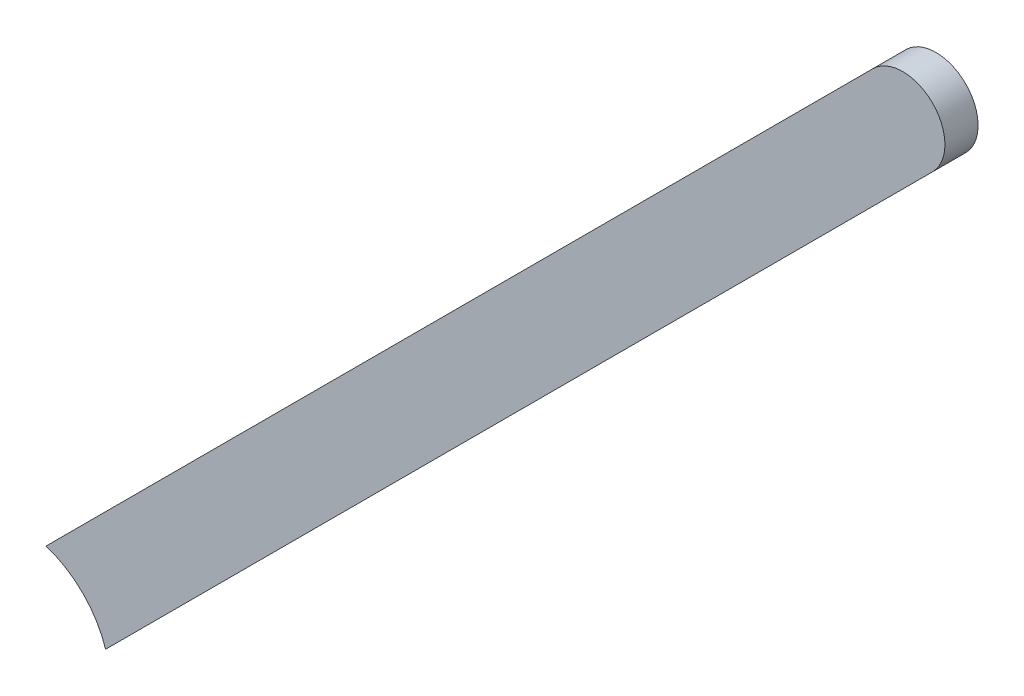
ISO-10303-21;
HEADER;
FILE_DESCRIPTION(('STEP AP214'),'2;1');
FILE_NAME('part.step','',(''),(''),'','','');
FILE_SCHEMA(('AUTOMOTIVE_DESIGN { 1 0 10303 214 1 1 1 1 }'));
ENDSEC;
DATA;
#1=APPLICATION_CONTEXT('core data for automotive mechanical design processes');
#2=APPLICATION_PROTOCOL_DEFINITION('international standard','automotive_design',2000,#1);
#3=PRODUCT_CONTEXT('',#1,'mechanical');
#4=PRODUCT('Part','Part','',(#3));
#5=PRODUCT_RELATED_PRODUCT_CATEGORY('part','',(#4));
#6=PRODUCT_DEFINITION_FORMATION('','',#4);
#7=PRODUCT_DEFINITION_CONTEXT('part definition',#1,'design');
#8=PRODUCT_DEFINITION('design','',#6,#7);
#9=PRODUCT_DEFINITION_SHAPE('','',#8);
#10=(LENGTH_UNIT() NAMED_UNIT(*) SI_UNIT(.MILLI.,.METRE.));
#11=(NAMED_UNIT(*) PLANE_ANGLE_UNIT() SI_UNIT($,.RADIAN.));
#12=(NAMED_UNIT(*) SI_UNIT($,.STERADIAN.) SOLID_ANGLE_UNIT());
#13=UNCERTAINTY_MEASURE_WITH_UNIT(LENGTH_MEASURE(1.E-05),#10,'distance_accuracy_value','');
#14=(GEOMETRIC_REPRESENTATION_CONTEXT(3) GLOBAL_UNCERTAINTY_ASSIGNED_CONTEXT((#13)) GLOBAL_UNIT_ASSIGNED_CONTEXT((#10,
#11,#12)) REPRESENTATION_CONTEXT('',''));
#15=CARTESIAN_POINT('',(0.,0.,0.));
#16=DIRECTION('',(0.,0.,1.));
#17=DIRECTION('',(1.,0.,0.));
#18=AXIS2_PLACEMENT_3D('',#15,#16,#17);
#19=CARTESIAN_POINT('',(94.3815390211441,98.7183299411441,0.));
#20=DIRECTION('',(-0.707106781186548,0.707106781186548,0.));
#21=DIRECTION('',(0.707106781186548,0.707106781186548,0.));
#22=AXIS2_PLACEMENT_3D('',#19,#20,#21);
#23=PLANE('',#22);
#24=DIRECTION('',(0.707106781186548,0.707106781186548,0.));
#25=VECTOR('',#24,1.);
#26=CARTESIAN_POINT('',(94.03260594,98.36939686,0.1999996));
#27=LINE('',#26,#25);
#28=CARTESIAN_POINT('',(94.3815390211441,98.7183299411441,0.1999996));
#29=VERTEX_POINT('',#28);
#30=CARTESIAN_POINT('',(99.36660594,103.70339686,0.1999996));
#31=VERTEX_POINT('',#30);
#32=EDGE_CURVE('E11',#29,#31,#27,.T.);
#33=ORIENTED_EDGE('',*,*,#32,.F.);
#34=DIRECTION('',(0.,0.,1.));
#35=VECTOR('',#34,1.);
#36=CARTESIAN_POINT('',(94.3815390211441,98.7183299411441,0.));
#37=LINE('',#36,#35);
#38=CARTESIAN_POINT('',(94.3815390211441,98.7183299411441,0.));
#39=VERTEX_POINT('',#38);
#40=EDGE_CURVE('E24',#39,#29,#37,.T.);
#41=ORIENTED_EDGE('',*,*,#40,.F.);
#42=DIRECTION('',(0.707106781186548,0.707106781186548,0.));
#43=VECTOR('',#42,1.);
#44=CARTESIAN_POINT('',(94.03260594,98.36939686,0.));
#45=LINE('',#44,#43);
#46=CARTESIAN_POINT('',(99.36660594,103.70339686,0.));
#47=VERTEX_POINT('',#46);
#48=EDGE_CURVE('E75',#39,#47,#45,.T.);
#49=ORIENTED_EDGE('',*,*,#48,.T.);
#50=DIRECTION('',(0.,0.,1.));
#51=VECTOR('',#50,1.);
#52=CARTESIAN_POINT('',(99.36660594,103.70339686,0.));
#53=LINE('',#52,#51);
#54=EDGE_CURVE('E37',#47,#31,#53,.T.);
#55=ORIENTED_EDGE('',*,*,#54,.T.);
#56=EDGE_LOOP('',(#33,#41,#49,#55));
#57=FACE_BOUND('',#56,.T.);
#58=ADVANCED_FACE('F17',(#57),#23,.F.);
#59=CARTESIAN_POINT('',(99.187,103.8830028,0.));
#60=DIRECTION('',(0.,0.,-1.));
#61=DIRECTION('',(0.707106781186548,-0.707106781186548,0.));
#62=AXIS2_PLACEMENT_3D('',#59,#60,#61);
#63=CYLINDRICAL_SURFACE('',#62,0.254001156230774);
#64=CARTESIAN_POINT('',(99.187,103.8830028,0.1999996));
#65=DIRECTION('',(0.,0.,1.));
#66=DIRECTION('',(0.707106781186548,-0.707106781186548,0.));
#67=AXIS2_PLACEMENT_3D('',#64,#65,#66);
#68=CIRCLE('',#67,0.254001156230774);
#69=CARTESIAN_POINT('',(99.00739406,104.06260874,0.1999996));
#70=VERTEX_POINT('',#69);
#71=EDGE_CURVE('E83',#31,#70,#68,.T.);
#72=ORIENTED_EDGE('',*,*,#71,.F.);
#73=ORIENTED_EDGE('',*,*,#54,.F.);
#74=CARTESIAN_POINT('',(99.187,103.8830028,0.));
#75=DIRECTION('',(0.,0.,1.));
#76=DIRECTION('',(0.707106781186548,-0.707106781186548,0.));
#77=AXIS2_PLACEMENT_3D('',#74,#75,#76);
#78=CIRCLE('',#77,0.254001156230774);
#79=CARTESIAN_POINT('',(99.00739406,104.06260874,0.));
#80=VERTEX_POINT('',#79);
#81=EDGE_CURVE('E81',#47,#80,#78,.T.);
#82=ORIENTED_EDGE('',*,*,#81,.T.);
#83=DIRECTION('',(0.,0.,1.));
#84=VECTOR('',#83,1.);
#85=CARTESIAN_POINT('',(99.00739406,104.06260874,0.));
#86=LINE('',#85,#84);
#87=EDGE_CURVE('E67',#80,#70,#86,.T.);
#88=ORIENTED_EDGE('',*,*,#87,.T.);
#89=EDGE_LOOP('',(#72,#73,#82,#88));
#90=FACE_BOUND('',#89,.T.);
#91=ADVANCED_FACE('F89',(#90),#63,.T.);
#92=CARTESIAN_POINT('',(99.00739406,104.06260874,0.));
#93=DIRECTION('',(0.707106781186548,-0.707106781186548,0.));
#94=DIRECTION('',(-0.707106781186548,-0.707106781186548,0.));
#95=AXIS2_PLACEMENT_3D('',#92,#93,#94);
#96=PLANE('',#95);
#97=DIRECTION('',(-0.707106781186548,-0.707106781186548,0.));
#98=VECTOR('',#97,1.);
#99=CARTESIAN_POINT('',(99.00739406,104.06260874,0.1999996));
#100=LINE('',#99,#98);
#101=CARTESIAN_POINT('',(94.0223271411441,99.0775418211441,0.1999996));
#102=VERTEX_POINT('',#101);
#103=EDGE_CURVE('E71',#70,#102,#100,.T.);
#104=ORIENTED_EDGE('',*,*,#103,.F.);
#105=ORIENTED_EDGE('',*,*,#87,.F.);
#106=DIRECTION('',(-0.707106781186548,-0.707106781186548,0.));
#107=VECTOR('',#106,1.);
#108=CARTESIAN_POINT('',(99.00739406,104.06260874,0.));
#109=LINE('',#108,#107);
#110=CARTESIAN_POINT('',(94.0223271411441,99.0775418211441,0.));
#111=VERTEX_POINT('',#110);
#112=EDGE_CURVE('E63',#80,#111,#109,.T.);
#113=ORIENTED_EDGE('',*,*,#112,.T.);
#114=DIRECTION('',(0.,0.,1.));
#115=VECTOR('',#114,1.);
#116=CARTESIAN_POINT('',(94.0223271411441,99.0775418211441,0.));
#117=LINE('',#116,#115);
#118=EDGE_CURVE('E53',#111,#102,#117,.T.);
#119=ORIENTED_EDGE('',*,*,#118,.T.);
#120=EDGE_LOOP('',(#104,#105,#113,#119));
#121=FACE_BOUND('',#120,.T.);
#122=ADVANCED_FACE('F66',(#121),#96,.F.);
#123=CARTESIAN_POINT('',(93.853,98.5490028,0.));
#124=DIRECTION('',(0.,0.,-1.));
#125=DIRECTION('',(1.,0.,0.));
#126=AXIS2_PLACEMENT_3D('',#123,#124,#125);
#127=CYLINDRICAL_SURFACE('',#126,0.55500016);
#128=ORIENTED_EDGE('',*,*,#40,.T.);
#129=CARTESIAN_POINT('',(93.853,98.5490028,0.1999996));
#130=DIRECTION('',(0.,0.,1.));
#131=DIRECTION('',(1.,0.,0.));
#132=AXIS2_PLACEMENT_3D('',#129,#130,#131);
#133=CIRCLE('',#132,0.55500016);
#134=EDGE_CURVE('E59',#29,#102,#133,.T.);
#135=ORIENTED_EDGE('',*,*,#134,.T.);
#136=ORIENTED_EDGE('',*,*,#118,.F.);
#137=CARTESIAN_POINT('',(93.853,98.5490028,0.));
#138=DIRECTION('',(0.,0.,1.));
#139=DIRECTION('',(1.,0.,0.));
#140=AXIS2_PLACEMENT_3D('',#137,#138,#139);
#141=CIRCLE('',#140,0.55500016);
#142=EDGE_CURVE('E57',#39,#111,#141,.T.);
#143=ORIENTED_EDGE('',*,*,#142,.F.);
#144=EDGE_LOOP('',(#128,#135,#136,#143));
#145=FACE_BOUND('',#144,.T.);
#146=ADVANCED_FACE('F55',(#145),#127,.F.);
#147=CARTESIAN_POINT('',(94.03260594,98.36939686,0.));
#148=DIRECTION('',(0.,0.,-1.));
#149=DIRECTION('',(-1.,0.,0.));
#150=AXIS2_PLACEMENT_3D('',#147,#148,#149);
#151=PLANE('',#150);
#152=ORIENTED_EDGE('',*,*,#48,.F.);
#153=ORIENTED_EDGE('',*,*,#142,.T.);
#154=ORIENTED_EDGE('',*,*,#112,.F.);
#155=ORIENTED_EDGE('',*,*,#81,.F.);
#156=EDGE_LOOP('',(#152,#153,#154,#155));
#157=FACE_BOUND('',#156,.T.);
#158=ADVANCED_FACE('F74',(#157),#151,.T.);
#159=CARTESIAN_POINT('',(94.03260594,98.36939686,0.1999996));
#160=DIRECTION('',(0.,0.,-1.));
#161=DIRECTION('',(-1.,0.,0.));
#162=AXIS2_PLACEMENT_3D('',#159,#160,#161);
#163=PLANE('',#162);
#164=ORIENTED_EDGE('',*,*,#134,.F.);
#165=ORIENTED_EDGE('',*,*,#32,.T.);
#166=ORIENTED_EDGE('',*,*,#71,.T.);
#167=ORIENTED_EDGE('',*,*,#103,.T.);
#168=EDGE_LOOP('',(#164,#165,#166,#167));
#169=FACE_BOUND('',#168,.T.);
#170=ADVANCED_FACE('F91',(#169),#163,.F.);
#171=CLOSED_SHELL('',(#58,#91,#122,#146,#158,#170));
#172=MANIFOLD_SOLID_BREP('B1',#171);
#173=ADVANCED_BREP_SHAPE_REPRESENTATION('',(#18,#172),#14);
#174=SHAPE_DEFINITION_REPRESENTATION(#9,#173);
ENDSEC;
END-ISO-10303-21;
